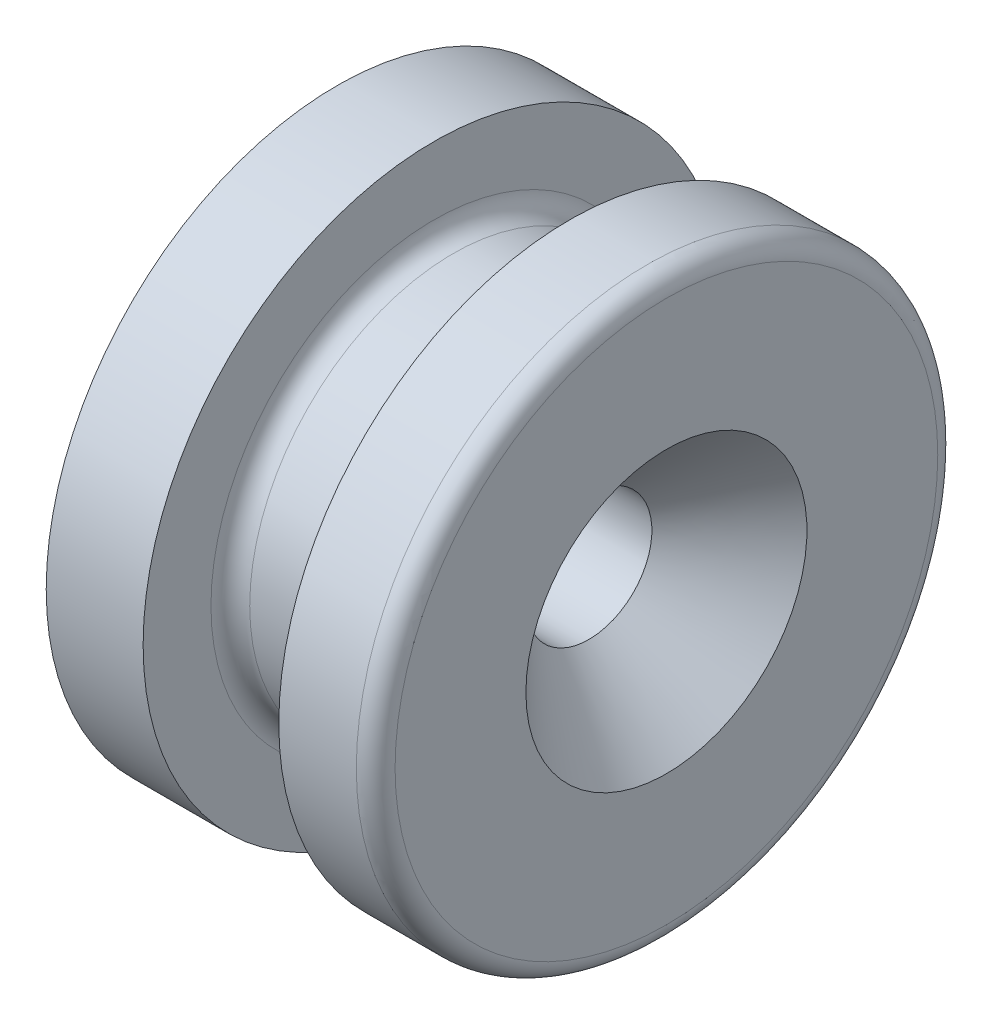
ISO-10303-21;
HEADER;
FILE_DESCRIPTION(('STEP AP214'),'2;1');
FILE_NAME('part.step','',(''),(''),'','','');
FILE_SCHEMA(('AUTOMOTIVE_DESIGN { 1 0 10303 214 1 1 1 1 }'));
ENDSEC;
DATA;
#1=APPLICATION_CONTEXT('core data for automotive mechanical design processes');
#2=APPLICATION_PROTOCOL_DEFINITION('international standard','automotive_design',2000,#1);
#3=PRODUCT_CONTEXT('',#1,'mechanical');
#4=PRODUCT('Part','Part','',(#3));
#5=PRODUCT_RELATED_PRODUCT_CATEGORY('part','',(#4));
#6=PRODUCT_DEFINITION_FORMATION('','',#4);
#7=PRODUCT_DEFINITION_CONTEXT('part definition',#1,'design');
#8=PRODUCT_DEFINITION('design','',#6,#7);
#9=PRODUCT_DEFINITION_SHAPE('','',#8);
#10=(LENGTH_UNIT() NAMED_UNIT(*) SI_UNIT(.MILLI.,.METRE.));
#11=(NAMED_UNIT(*) PLANE_ANGLE_UNIT() SI_UNIT($,.RADIAN.));
#12=(NAMED_UNIT(*) SI_UNIT($,.STERADIAN.) SOLID_ANGLE_UNIT());
#13=UNCERTAINTY_MEASURE_WITH_UNIT(LENGTH_MEASURE(1.E-05),#10,'distance_accuracy_value','');
#14=(GEOMETRIC_REPRESENTATION_CONTEXT(3) GLOBAL_UNCERTAINTY_ASSIGNED_CONTEXT((#13)) GLOBAL_UNIT_ASSIGNED_CONTEXT((#10,
#11,#12)) REPRESENTATION_CONTEXT('',''));
#15=CARTESIAN_POINT('',(0.,0.,0.));
#16=DIRECTION('',(0.,0.,1.));
#17=DIRECTION('',(1.,0.,0.));
#18=AXIS2_PLACEMENT_3D('',#15,#16,#17);
#19=CARTESIAN_POINT('',(17.,3.25,0.));
#20=DIRECTION('',(-1.,0.,0.));
#21=DIRECTION('',(0.,0.,1.));
#22=AXIS2_PLACEMENT_3D('',#19,#20,#21);
#23=PLANE('',#22);
#24=CARTESIAN_POINT('',(17.,0.,0.));
#25=DIRECTION('',(-1.,0.,0.));
#26=DIRECTION('',(0.,0.,1.));
#27=AXIS2_PLACEMENT_3D('',#24,#25,#26);
#28=CIRCLE('',#27,7.24999999999999);
#29=CARTESIAN_POINT('',(17.,0.,7.24999999999999));
#30=VERTEX_POINT('',#29);
#31=EDGE_CURVE('E43',#30,#30,#28,.T.);
#32=ORIENTED_EDGE('',*,*,#31,.T.);
#33=EDGE_LOOP('',(#32));
#34=FACE_BOUND('',#33,.T.);
#35=CARTESIAN_POINT('',(17.,0.,0.));
#36=DIRECTION('',(-1.,0.,0.));
#37=DIRECTION('',(0.,0.,1.));
#38=AXIS2_PLACEMENT_3D('',#35,#36,#37);
#39=CIRCLE('',#38,14.);
#40=CARTESIAN_POINT('',(17.,0.,14.));
#41=VERTEX_POINT('',#40);
#42=EDGE_CURVE('E62',#41,#41,#39,.F.);
#43=ORIENTED_EDGE('',*,*,#42,.T.);
#44=EDGE_LOOP('',(#43));
#45=FACE_BOUND('',#44,.T.);
#46=ADVANCED_FACE('F36',(#34,#45),#23,.F.);
#47=CARTESIAN_POINT('',(-8.12193012798341,0.,0.));
#48=DIRECTION('',(-1.,0.,0.));
#49=DIRECTION('',(0.,0.,1.));
#50=AXIS2_PLACEMENT_3D('',#47,#48,#49);
#51=CYLINDRICAL_SURFACE('',#50,3.25);
#52=CARTESIAN_POINT('',(13.,0.,0.));
#53=DIRECTION('',(-1.,0.,0.));
#54=DIRECTION('',(0.,0.,1.));
#55=AXIS2_PLACEMENT_3D('',#52,#53,#54);
#56=CIRCLE('',#55,3.25);
#57=CARTESIAN_POINT('',(13.,0.,3.25));
#58=VERTEX_POINT('',#57);
#59=EDGE_CURVE('E10',#58,#58,#56,.F.);
#60=ORIENTED_EDGE('',*,*,#59,.T.);
#61=EDGE_LOOP('',(#60));
#62=FACE_BOUND('',#61,.T.);
#63=CARTESIAN_POINT('',(0.,0.,0.));
#64=DIRECTION('',(-1.,0.,0.));
#65=DIRECTION('',(0.,0.,1.));
#66=AXIS2_PLACEMENT_3D('',#63,#64,#65);
#67=CIRCLE('',#66,3.25);
#68=CARTESIAN_POINT('',(0.,0.,3.25));
#69=VERTEX_POINT('',#68);
#70=EDGE_CURVE('E68',#69,#69,#67,.T.);
#71=ORIENTED_EDGE('',*,*,#70,.T.);
#72=EDGE_LOOP('',(#71));
#73=FACE_BOUND('',#72,.T.);
#74=ADVANCED_FACE('F99',(#62,#73),#51,.F.);
#75=CARTESIAN_POINT('',(0.,3.25,0.));
#76=DIRECTION('',(1.,0.,0.));
#77=DIRECTION('',(0.,0.,-1.));
#78=AXIS2_PLACEMENT_3D('',#75,#76,#77);
#79=PLANE('',#78);
#80=ORIENTED_EDGE('',*,*,#70,.F.);
#81=EDGE_LOOP('',(#80));
#82=FACE_BOUND('',#81,.T.);
#83=CARTESIAN_POINT('',(0.,0.,0.));
#84=DIRECTION('',(-1.,0.,0.));
#85=DIRECTION('',(0.,0.,1.));
#86=AXIS2_PLACEMENT_3D('',#83,#84,#85);
#87=CIRCLE('',#86,15.);
#88=CARTESIAN_POINT('',(0.,0.,15.));
#89=VERTEX_POINT('',#88);
#90=EDGE_CURVE('E71',#89,#89,#87,.T.);
#91=ORIENTED_EDGE('',*,*,#90,.T.);
#92=EDGE_LOOP('',(#91));
#93=FACE_BOUND('',#92,.T.);
#94=ADVANCED_FACE('F104',(#82,#93),#79,.F.);
#95=CARTESIAN_POINT('',(-8.12193012798341,0.,0.));
#96=DIRECTION('',(-1.,0.,0.));
#97=DIRECTION('',(0.,0.,1.));
#98=AXIS2_PLACEMENT_3D('',#95,#96,#97);
#99=CYLINDRICAL_SURFACE('',#98,15.);
#100=ORIENTED_EDGE('',*,*,#90,.F.);
#101=EDGE_LOOP('',(#100));
#102=FACE_BOUND('',#101,.T.);
#103=CARTESIAN_POINT('',(5.,0.,0.));
#104=DIRECTION('',(-1.,0.,0.));
#105=DIRECTION('',(0.,0.,1.));
#106=AXIS2_PLACEMENT_3D('',#103,#104,#105);
#107=CIRCLE('',#106,15.);
#108=CARTESIAN_POINT('',(5.,0.,15.));
#109=VERTEX_POINT('',#108);
#110=EDGE_CURVE('E74',#109,#109,#107,.T.);
#111=ORIENTED_EDGE('',*,*,#110,.T.);
#112=EDGE_LOOP('',(#111));
#113=FACE_BOUND('',#112,.T.);
#114=ADVANCED_FACE('F125',(#102,#113),#99,.T.);
#115=CARTESIAN_POINT('',(5.,15.,0.));
#116=DIRECTION('',(-1.,0.,0.));
#117=DIRECTION('',(0.,0.,1.));
#118=AXIS2_PLACEMENT_3D('',#115,#116,#117);
#119=PLANE('',#118);
#120=CARTESIAN_POINT('',(5.,0.,0.));
#121=DIRECTION('',(-1.,0.,0.));
#122=DIRECTION('',(0.,0.,1.));
#123=AXIS2_PLACEMENT_3D('',#120,#121,#122);
#124=CIRCLE('',#123,11.5);
#125=CARTESIAN_POINT('',(5.,0.,11.5));
#126=VERTEX_POINT('',#125);
#127=EDGE_CURVE('E47',#126,#126,#124,.T.);
#128=ORIENTED_EDGE('',*,*,#127,.T.);
#129=EDGE_LOOP('',(#128));
#130=FACE_BOUND('',#129,.T.);
#131=ORIENTED_EDGE('',*,*,#110,.F.);
#132=EDGE_LOOP('',(#131));
#133=FACE_BOUND('',#132,.T.);
#134=ADVANCED_FACE('F122',(#130,#133),#119,.F.);
#135=CARTESIAN_POINT('',(-8.12193012798341,0.,0.));
#136=DIRECTION('',(-1.,0.,0.));
#137=DIRECTION('',(0.,0.,1.));
#138=AXIS2_PLACEMENT_3D('',#135,#136,#137);
#139=CYLINDRICAL_SURFACE('',#138,10.5);
#140=CARTESIAN_POINT('',(11.,0.,0.));
#141=DIRECTION('',(1.,0.,0.));
#142=DIRECTION('',(0.,0.,-1.));
#143=AXIS2_PLACEMENT_3D('',#140,#141,#142);
#144=CIRCLE('',#143,10.5);
#145=CARTESIAN_POINT('',(11.,0.,-10.5));
#146=VERTEX_POINT('',#145);
#147=EDGE_CURVE('E56',#146,#146,#144,.F.);
#148=ORIENTED_EDGE('',*,*,#147,.T.);
#149=EDGE_LOOP('',(#148));
#150=FACE_BOUND('',#149,.T.);
#151=CARTESIAN_POINT('',(6.,0.,0.));
#152=DIRECTION('',(-1.,0.,0.));
#153=DIRECTION('',(0.,0.,1.));
#154=AXIS2_PLACEMENT_3D('',#151,#152,#153);
#155=CIRCLE('',#154,10.5);
#156=CARTESIAN_POINT('',(6.,0.,10.5));
#157=VERTEX_POINT('',#156);
#158=EDGE_CURVE('E59',#157,#157,#155,.F.);
#159=ORIENTED_EDGE('',*,*,#158,.T.);
#160=EDGE_LOOP('',(#159));
#161=FACE_BOUND('',#160,.T.);
#162=ADVANCED_FACE('F95',(#150,#161),#139,.T.);
#163=CARTESIAN_POINT('',(12.,15.,0.));
#164=DIRECTION('',(1.,0.,0.));
#165=DIRECTION('',(0.,0.,-1.));
#166=AXIS2_PLACEMENT_3D('',#163,#164,#165);
#167=PLANE('',#166);
#168=CARTESIAN_POINT('',(12.,0.,0.));
#169=DIRECTION('',(1.,0.,0.));
#170=DIRECTION('',(0.,0.,-1.));
#171=AXIS2_PLACEMENT_3D('',#168,#169,#170);
#172=CIRCLE('',#171,11.5);
#173=CARTESIAN_POINT('',(12.,0.,-11.5));
#174=VERTEX_POINT('',#173);
#175=EDGE_CURVE('E51',#174,#174,#172,.T.);
#176=ORIENTED_EDGE('',*,*,#175,.T.);
#177=EDGE_LOOP('',(#176));
#178=FACE_BOUND('',#177,.T.);
#179=CARTESIAN_POINT('',(12.,0.,0.));
#180=DIRECTION('',(-1.,0.,0.));
#181=DIRECTION('',(0.,0.,1.));
#182=AXIS2_PLACEMENT_3D('',#179,#180,#181);
#183=CIRCLE('',#182,15.);
#184=CARTESIAN_POINT('',(12.,0.,15.));
#185=VERTEX_POINT('',#184);
#186=EDGE_CURVE('E77',#185,#185,#183,.T.);
#187=ORIENTED_EDGE('',*,*,#186,.T.);
#188=EDGE_LOOP('',(#187));
#189=FACE_BOUND('',#188,.T.);
#190=ADVANCED_FACE('F81',(#178,#189),#167,.F.);
#191=CARTESIAN_POINT('',(-8.12193012798341,0.,0.));
#192=DIRECTION('',(-1.,0.,0.));
#193=DIRECTION('',(0.,0.,1.));
#194=AXIS2_PLACEMENT_3D('',#191,#192,#193);
#195=CYLINDRICAL_SURFACE('',#194,15.);
#196=CARTESIAN_POINT('',(16.,0.,0.));
#197=DIRECTION('',(-1.,0.,0.));
#198=DIRECTION('',(0.,0.,1.));
#199=AXIS2_PLACEMENT_3D('',#196,#197,#198);
#200=CIRCLE('',#199,15.);
#201=CARTESIAN_POINT('',(16.,0.,15.));
#202=VERTEX_POINT('',#201);
#203=EDGE_CURVE('E65',#202,#202,#200,.T.);
#204=ORIENTED_EDGE('',*,*,#203,.T.);
#205=EDGE_LOOP('',(#204));
#206=FACE_BOUND('',#205,.T.);
#207=ORIENTED_EDGE('',*,*,#186,.F.);
#208=EDGE_LOOP('',(#207));
#209=FACE_BOUND('',#208,.T.);
#210=ADVANCED_FACE('F83',(#206,#209),#195,.T.);
#211=CARTESIAN_POINT('',(16.,0.,0.));
#212=DIRECTION('',(-1.,0.,0.));
#213=DIRECTION('',(0.,0.,1.));
#214=AXIS2_PLACEMENT_3D('',#211,#212,#213);
#215=TOROIDAL_SURFACE('',#214,14.,1.);
#216=ORIENTED_EDGE('',*,*,#42,.F.);
#217=EDGE_LOOP('',(#216));
#218=FACE_BOUND('',#217,.T.);
#219=ORIENTED_EDGE('',*,*,#203,.F.);
#220=EDGE_LOOP('',(#219));
#221=FACE_BOUND('',#220,.T.);
#222=ADVANCED_FACE('F85',(#218,#221),#215,.T.);
#223=CARTESIAN_POINT('',(11.,0.,0.));
#224=DIRECTION('',(1.,0.,0.));
#225=DIRECTION('',(0.,0.,-1.));
#226=AXIS2_PLACEMENT_3D('',#223,#224,#225);
#227=TOROIDAL_SURFACE('',#226,11.5,1.);
#228=ORIENTED_EDGE('',*,*,#175,.F.);
#229=EDGE_LOOP('',(#228));
#230=FACE_BOUND('',#229,.T.);
#231=ORIENTED_EDGE('',*,*,#147,.F.);
#232=EDGE_LOOP('',(#231));
#233=FACE_BOUND('',#232,.T.);
#234=ADVANCED_FACE('F92',(#230,#233),#227,.F.);
#235=CARTESIAN_POINT('',(6.,0.,0.));
#236=DIRECTION('',(-1.,0.,0.));
#237=DIRECTION('',(0.,0.,1.));
#238=AXIS2_PLACEMENT_3D('',#235,#236,#237);
#239=TOROIDAL_SURFACE('',#238,11.5,1.);
#240=ORIENTED_EDGE('',*,*,#158,.F.);
#241=EDGE_LOOP('',(#240));
#242=FACE_BOUND('',#241,.T.);
#243=ORIENTED_EDGE('',*,*,#127,.F.);
#244=EDGE_LOOP('',(#243));
#245=FACE_BOUND('',#244,.T.);
#246=ADVANCED_FACE('F110',(#242,#245),#239,.F.);
#247=CARTESIAN_POINT('',(17.,0.,0.));
#248=DIRECTION('',(1.,0.,0.));
#249=DIRECTION('',(0.,0.,-1.));
#250=AXIS2_PLACEMENT_3D('',#247,#248,#249);
#251=CONICAL_SURFACE('',#250,7.24999999999999,0.785398163397446);
#252=ORIENTED_EDGE('',*,*,#59,.F.);
#253=EDGE_LOOP('',(#252));
#254=FACE_BOUND('',#253,.T.);
#255=ORIENTED_EDGE('',*,*,#31,.F.);
#256=EDGE_LOOP('',(#255));
#257=FACE_BOUND('',#256,.T.);
#258=ADVANCED_FACE('F38',(#254,#257),#251,.F.);
#259=CLOSED_SHELL('',(#46,#74,#94,#114,#134,#162,#190,#210,#222,#234,#246,#258));
#260=MANIFOLD_SOLID_BREP('B2',#259);
#261=ADVANCED_BREP_SHAPE_REPRESENTATION('',(#18,#260),#14);
#262=SHAPE_DEFINITION_REPRESENTATION(#9,#261);
ENDSEC;
END-ISO-10303-21;
